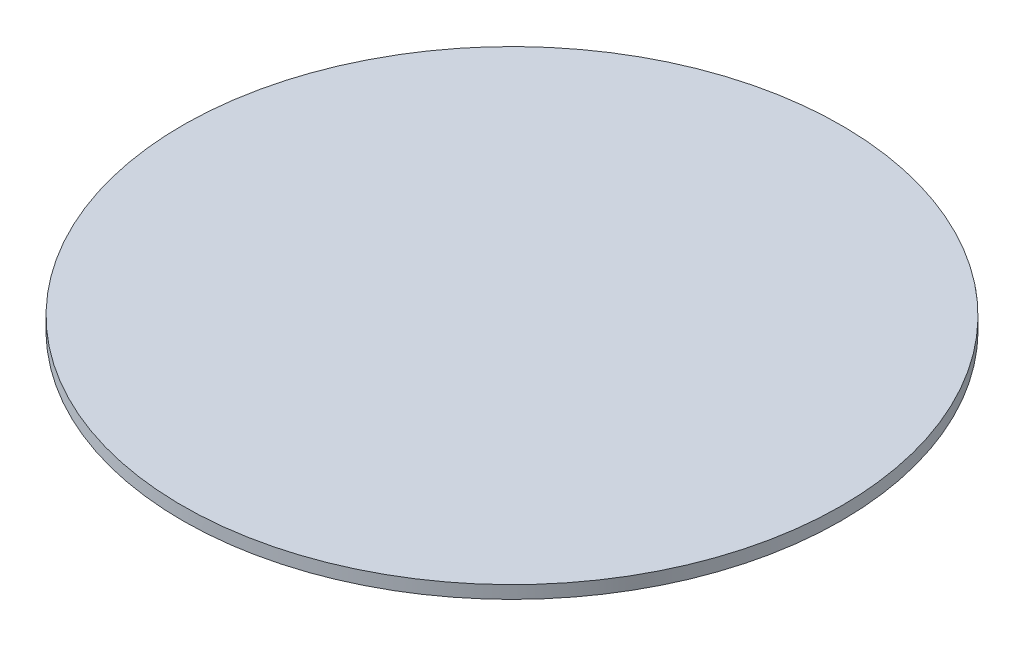
ISO-10303-21;
HEADER;
FILE_DESCRIPTION(('STEP AP214'),'2;1');
FILE_NAME('part.step','',(''),(''),'','','');
FILE_SCHEMA(('AUTOMOTIVE_DESIGN { 1 0 10303 214 1 1 1 1 }'));
ENDSEC;
DATA;
#1=APPLICATION_CONTEXT('core data for automotive mechanical design processes');
#2=APPLICATION_PROTOCOL_DEFINITION('international standard','automotive_design',2000,#1);
#3=PRODUCT_CONTEXT('',#1,'mechanical');
#4=PRODUCT('Part','Part','',(#3));
#5=PRODUCT_RELATED_PRODUCT_CATEGORY('part','',(#4));
#6=PRODUCT_DEFINITION_FORMATION('','',#4);
#7=PRODUCT_DEFINITION_CONTEXT('part definition',#1,'design');
#8=PRODUCT_DEFINITION('design','',#6,#7);
#9=PRODUCT_DEFINITION_SHAPE('','',#8);
#10=(LENGTH_UNIT() NAMED_UNIT(*) SI_UNIT(.MILLI.,.METRE.));
#11=(NAMED_UNIT(*) PLANE_ANGLE_UNIT() SI_UNIT($,.RADIAN.));
#12=(NAMED_UNIT(*) SI_UNIT($,.STERADIAN.) SOLID_ANGLE_UNIT());
#13=UNCERTAINTY_MEASURE_WITH_UNIT(LENGTH_MEASURE(1.E-05),#10,'distance_accuracy_value','');
#14=(GEOMETRIC_REPRESENTATION_CONTEXT(3) GLOBAL_UNCERTAINTY_ASSIGNED_CONTEXT((#13)) GLOBAL_UNIT_ASSIGNED_CONTEXT((#10,
#11,#12)) REPRESENTATION_CONTEXT('',''));
#15=CARTESIAN_POINT('',(0.,0.,0.));
#16=DIRECTION('',(0.,0.,1.));
#17=DIRECTION('',(1.,0.,0.));
#18=AXIS2_PLACEMENT_3D('',#15,#16,#17);
#19=CARTESIAN_POINT('',(109.960636938142,1.36028586489377,75.));
#20=CARTESIAN_POINT('',(109.960636938142,1.36028586489377,72.7118506445293));
#21=CARTESIAN_POINT('',(109.50991085592,1.36028586489377,68.135551933588));
#22=CARTESIAN_POINT('',(107.507625211775,1.36028586489377,61.5349007567413));
#23=CARTESIAN_POINT('',(104.256089761227,1.36028586489377,55.4517057924985));
#24=CARTESIAN_POINT('',(99.8802591881598,1.36028586489377,50.1197408118402));
#25=CARTESIAN_POINT('',(94.5482942075016,1.36028586489377,45.7439102387728));
#26=CARTESIAN_POINT('',(88.4650992432587,1.36028586489377,42.4923747882252));
#27=CARTESIAN_POINT('',(81.864448066412,1.36028586489377,40.4900891440799));
#28=CARTESIAN_POINT('',(75.,1.36028586489377,39.8140000207466));
#29=CARTESIAN_POINT('',(68.135551933588,1.36028586489377,40.4900891440799));
#30=CARTESIAN_POINT('',(61.5349007567413,1.36028586489377,42.4923747882252));
#31=CARTESIAN_POINT('',(55.4517057924985,1.36028586489377,45.7439102387728));
#32=CARTESIAN_POINT('',(50.1197408118402,1.36028586489377,50.1197408118402));
#33=CARTESIAN_POINT('',(45.7439102387728,1.36028586489377,55.4517057924985));
#34=CARTESIAN_POINT('',(42.4923747882252,1.36028586489377,61.5349007567413));
#35=CARTESIAN_POINT('',(40.4900891440799,1.36028586489377,68.135551933588));
#36=CARTESIAN_POINT('',(39.8140000207466,1.36028586489377,75.));
#37=CARTESIAN_POINT('',(40.4900891440799,1.36028586489377,81.864448066412));
#38=CARTESIAN_POINT('',(42.4923747882252,1.36028586489377,88.4650992432587));
#39=CARTESIAN_POINT('',(45.7439102387728,1.36028586489377,94.5482942075015));
#40=CARTESIAN_POINT('',(50.1197408118402,1.36028586489377,99.8802591881598));
#41=CARTESIAN_POINT('',(55.4517057924985,1.36028586489377,104.256089761227));
#42=CARTESIAN_POINT('',(61.5349007567413,1.36028586489377,107.507625211775));
#43=CARTESIAN_POINT('',(68.1355519335879,1.36028586489377,109.50991085592));
#44=CARTESIAN_POINT('',(75.,1.36028586489377,110.185999979253));
#45=CARTESIAN_POINT('',(81.864448066412,1.36028586489377,109.50991085592));
#46=CARTESIAN_POINT('',(88.4650992432587,1.36028586489377,107.507625211775));
#47=CARTESIAN_POINT('',(94.5482942075015,1.36028586489377,104.256089761227));
#48=CARTESIAN_POINT('',(99.8802591881598,1.36028586489377,99.8802591881598));
#49=CARTESIAN_POINT('',(104.256089761227,1.36028586489377,94.5482942075016));
#50=CARTESIAN_POINT('',(107.507625211775,1.36028586489377,88.4650992432587));
#51=CARTESIAN_POINT('',(109.50991085592,1.36028586489377,81.8644480664121));
#52=CARTESIAN_POINT('',(109.960636938142,1.36028586489377,77.2881493554707));
#53=CARTESIAN_POINT('',(109.960636938142,1.36028586489377,75.));
#54=B_SPLINE_CURVE_WITH_KNOTS('',3,(#19,#20,#21,#22,#23,#24,#25,#26,#27,#28,#29,#30,#31,#32,#33,
#34,#35,#36,#37,#38,#39,#40,#41,#42,#43,#44,#45,#46,#47,#48,#49,#50,#51,#52,#53),.UNSPECIFIED.,
.T.,.F.,(4,1,1,1,1,1,1,1,1,1,1,1,1,1,1,1,1,1,1,1,1,1,1,1,1,1,1,1,1,1,1,1,4),(0.,0.03125,0.0625,
0.09375,0.125,0.15625,0.1875,0.21875,0.25,0.28125,0.3125,0.34375,0.375,0.40625,0.4375,0.46875,
0.5,0.53125,0.5625,0.59375,0.625,0.65625,0.6875,0.71875,0.75,0.78125,0.8125,0.84375,0.875,
0.90625,0.9375,0.96875,1.),.UNSPECIFIED.);
#55=DIRECTION('',(0.,-1.,0.));
#56=VECTOR('',#55,1.);
#57=SURFACE_OF_LINEAR_EXTRUSION('',#54,#56);
#58=CARTESIAN_POINT('',(109.960636938142,1.36028586489377,75.));
#59=CARTESIAN_POINT('',(109.960636938142,1.36028586489377,77.2881493554707));
#60=CARTESIAN_POINT('',(109.50991085592,1.36028586489377,81.8644480664121));
#61=CARTESIAN_POINT('',(107.507625211775,1.36028586489377,88.4650992432587));
#62=CARTESIAN_POINT('',(104.256089761227,1.36028586489377,94.5482942075016));
#63=CARTESIAN_POINT('',(99.8802591881598,1.36028586489377,99.8802591881598));
#64=CARTESIAN_POINT('',(94.5482942075015,1.36028586489377,104.256089761227));
#65=CARTESIAN_POINT('',(88.4650992432587,1.36028586489377,107.507625211775));
#66=CARTESIAN_POINT('',(81.864448066412,1.36028586489377,109.50991085592));
#67=CARTESIAN_POINT('',(75.,1.36028586489377,110.185999979253));
#68=CARTESIAN_POINT('',(68.1355519335879,1.36028586489377,109.50991085592));
#69=CARTESIAN_POINT('',(61.5349007567413,1.36028586489377,107.507625211775));
#70=CARTESIAN_POINT('',(55.4517057924985,1.36028586489377,104.256089761227));
#71=CARTESIAN_POINT('',(50.1197408118402,1.36028586489377,99.8802591881598));
#72=CARTESIAN_POINT('',(45.7439102387728,1.36028586489377,94.5482942075015));
#73=CARTESIAN_POINT('',(42.4923747882252,1.36028586489377,88.4650992432587));
#74=CARTESIAN_POINT('',(40.4900891440799,1.36028586489377,81.864448066412));
#75=CARTESIAN_POINT('',(39.8140000207466,1.36028586489377,75.));
#76=CARTESIAN_POINT('',(40.4900891440799,1.36028586489377,68.135551933588));
#77=CARTESIAN_POINT('',(42.4923747882252,1.36028586489377,61.5349007567413));
#78=CARTESIAN_POINT('',(45.7439102387728,1.36028586489377,55.4517057924985));
#79=CARTESIAN_POINT('',(50.1197408118402,1.36028586489377,50.1197408118402));
#80=CARTESIAN_POINT('',(55.4517057924985,1.36028586489377,45.7439102387728));
#81=CARTESIAN_POINT('',(61.5349007567413,1.36028586489377,42.4923747882252));
#82=CARTESIAN_POINT('',(68.135551933588,1.36028586489377,40.4900891440799));
#83=CARTESIAN_POINT('',(75.,1.36028586489377,39.8140000207466));
#84=CARTESIAN_POINT('',(81.864448066412,1.36028586489377,40.4900891440799));
#85=CARTESIAN_POINT('',(88.4650992432587,1.36028586489377,42.4923747882252));
#86=CARTESIAN_POINT('',(94.5482942075016,1.36028586489377,45.7439102387728));
#87=CARTESIAN_POINT('',(99.8802591881598,1.36028586489377,50.1197408118402));
#88=CARTESIAN_POINT('',(104.256089761227,1.36028586489377,55.4517057924985));
#89=CARTESIAN_POINT('',(107.507625211775,1.36028586489377,61.5349007567413));
#90=CARTESIAN_POINT('',(109.50991085592,1.36028586489377,68.135551933588));
#91=CARTESIAN_POINT('',(109.960636938142,1.36028586489377,72.7118506445293));
#92=CARTESIAN_POINT('',(109.960636938142,1.36028586489377,75.));
#93=B_SPLINE_CURVE_WITH_KNOTS('',3,(#58,#59,#60,#61,#62,#63,#64,#65,#66,#67,#68,#69,#70,#71,#72,
#73,#74,#75,#76,#77,#78,#79,#80,#81,#82,#83,#84,#85,#86,#87,#88,#89,#90,#91,#92),.UNSPECIFIED.,
.T.,.F.,(4,1,1,1,1,1,1,1,1,1,1,1,1,1,1,1,1,1,1,1,1,1,1,1,1,1,1,1,1,1,1,1,4),(0.,0.03125,
0.0624999999999999,0.0937499999999999,0.125,0.15625,0.1875,0.21875,0.25,0.28125,0.3125,0.34375,
0.375,0.40625,0.4375,0.46875,0.5,0.53125,0.5625,0.59375,0.625,0.65625,0.6875,0.71875,0.75,
0.78125,0.8125,0.84375,0.875,0.90625,0.9375,0.96875,1.),.UNSPECIFIED.);
#94=CARTESIAN_POINT('',(109.960636938142,1.36028586489377,75.));
#95=VERTEX_POINT('',#94);
#96=EDGE_CURVE('E9',#95,#95,#93,.F.);
#97=ORIENTED_EDGE('',*,*,#96,.F.);
#98=EDGE_LOOP('',(#97));
#99=FACE_BOUND('',#98,.T.);
#100=CARTESIAN_POINT('',(109.960636938142,0.000999999999999916,75.));
#101=CARTESIAN_POINT('',(109.960636915795,0.000999999999999485,74.5423682963403));
#102=CARTESIAN_POINT('',(109.9516223464,0.000999999999999429,74.084738593119));
#103=CARTESIAN_POINT('',(109.915633566544,0.000999999999999535,73.1701826381083));
#104=CARTESIAN_POINT('',(109.888659238234,0.000999999999999696,72.7132563909545));
#105=CARTESIAN_POINT('',(109.816820273983,0.000999999999999702,71.800811280723));
#106=CARTESIAN_POINT('',(109.771955577568,0.000999999999999545,71.3452924224079));
#107=CARTESIAN_POINT('',(109.664404995955,0.000999999999999419,70.4363648101717));
#108=CARTESIAN_POINT('',(109.601719170999,0.00099999999999945,69.982956049123));
#109=CARTESIAN_POINT('',(109.458595311542,0.000999999999999515,69.0789513463994));
#110=CARTESIAN_POINT('',(109.378157393532,0.00099999999999955,68.6283553862869));
#111=CARTESIAN_POINT('',(109.199598811371,0.000999999999999415,67.7306807774109));
#112=CARTESIAN_POINT('',(109.10147814722,0.000999999999999245,67.2836021286476));
#113=CARTESIAN_POINT('',(108.887759733401,0.000999999999999286,66.3936395669513));
#114=CARTESIAN_POINT('',(108.772161869054,0.000999999999999498,65.9507556815629));
#115=CARTESIAN_POINT('',(108.523694095487,0.000999999999999467,65.0698581972033));
#116=CARTESIAN_POINT('',(108.390824127884,0.000999999999999224,64.6318446147003));
#117=CARTESIAN_POINT('',(108.108017110464,0.000999999999999307,63.7613638257889));
#118=CARTESIAN_POINT('',(107.958080118341,0.000999999999999632,63.328896600637));
#119=CARTESIAN_POINT('',(107.641343777703,0.000999999999999766,62.4701841862697));
#120=CARTESIAN_POINT('',(107.474544539842,0.000999999999999575,62.0439389562451));
#121=CARTESIAN_POINT('',(107.124289281574,0.00099999999999939,61.1983479614389));
#122=CARTESIAN_POINT('',(106.940833261168,0.000999999999999396,60.7790021966573));
#123=CARTESIAN_POINT('',(106.557598304182,0.000999999999999569,59.9478344110449));
#124=CARTESIAN_POINT('',(106.357819260501,0.000999999999999735,59.5360124396018));
#125=CARTESIAN_POINT('',(105.942271151596,0.000999999999999663,58.7205148111294));
#126=CARTESIAN_POINT('',(105.726502032323,0.000999999999999423,58.3168391816418));
#127=CARTESIAN_POINT('',(105.279306695039,0.000999999999999542,57.5182573491605));
#128=CARTESIAN_POINT('',(105.047880529956,0.000999999999999901,57.1233511165282));
#129=CARTESIAN_POINT('',(104.569703707848,0.000999999999999931,56.3429308150904));
#130=CARTESIAN_POINT('',(104.322953151388,0.000999999999999602,55.9574166846725));
#131=CARTESIAN_POINT('',(103.814461330226,0.000999999999999362,55.1964048948526));
#132=CARTESIAN_POINT('',(103.552720065523,0.000999999999999451,54.8209072354506));
#133=CARTESIAN_POINT('',(103.01469606983,0.000999999999999514,54.0804755369417));
#134=CARTESIAN_POINT('',(102.738413243433,0.000999999999999489,53.7155415671679));
#135=CARTESIAN_POINT('',(102.171754079978,0.000999999999999475,52.9967829113382));
#136=CARTESIAN_POINT('',(101.881377695282,0.000999999999999486,52.6429582628393));
#137=CARTESIAN_POINT('',(101.286979504154,0.000999999999999478,51.946964438699));
#138=CARTESIAN_POINT('',(100.98295774385,0.000999999999999459,51.6047952236627));
#139=CARTESIAN_POINT('',(100.361716507381,0.000999999999999505,50.9326581496905));
#140=CARTESIAN_POINT('',(100.044497117829,0.00099999999999957,50.6026902107065));
#141=CARTESIAN_POINT('',(99.3973097892936,0.000999999999999395,49.9555028821709));
#142=CARTESIAN_POINT('',(99.0673418503095,0.000999999999999154,49.6382834926194));
#143=CARTESIAN_POINT('',(98.3952047763373,0.000999999999999376,49.0170422561501));
#144=CARTESIAN_POINT('',(98.053035561301,0.000999999999999838,48.7130204958461));
#145=CARTESIAN_POINT('',(97.3570417371607,0.000999999999999994,48.1186223047178));
#146=CARTESIAN_POINT('',(97.0032170886618,0.000999999999999687,47.8282459200224));
#147=CARTESIAN_POINT('',(96.2844584328321,0.000999999999999711,47.261586756567));
#148=CARTESIAN_POINT('',(95.9195244630583,0.00100000000000004,46.9853039301699));
#149=CARTESIAN_POINT('',(95.1790927645494,0.00100000000000022,46.4472799344772));
#150=CARTESIAN_POINT('',(94.8035951051474,0.00100000000000007,46.185538669774));
#151=CARTESIAN_POINT('',(94.0425833153275,0.00099999999999976,45.6770468486116));
#152=CARTESIAN_POINT('',(93.6570691849096,0.000999999999999601,45.4302962921524));
#153=CARTESIAN_POINT('',(92.8766488834719,0.000999999999999797,44.9521194700439));
#154=CARTESIAN_POINT('',(92.4817426508395,0.00100000000000015,44.720693304961));
#155=CARTESIAN_POINT('',(91.6831608183582,0.00100000000000011,44.2734979676768));
#156=CARTESIAN_POINT('',(91.2794851888705,0.000999999999999715,44.0577288484037));
#157=CARTESIAN_POINT('',(90.4639875603984,0.000999999999999683,43.6421807394988));
#158=CARTESIAN_POINT('',(90.0521655889557,0.00100000000000005,43.4424016958181));
#159=CARTESIAN_POINT('',(89.2209978033422,0.00100000000000022,43.059166738832));
#160=CARTESIAN_POINT('',(88.801652038559,0.00100000000000002,42.875710718426));
#161=CARTESIAN_POINT('',(87.9560610437572,0.000999999999999813,42.5254554601586));
#162=CARTESIAN_POINT('',(87.5298158137385,0.000999999999999805,42.3586562222971));
#163=CARTESIAN_POINT('',(86.6711033993548,0.00100000000000003,42.0419198816585));
#164=CARTESIAN_POINT('',(86.2386361741805,0.00100000000000026,41.8919828895354));
#165=CARTESIAN_POINT('',(85.3681553853304,0.00100000000000001,41.6091758721171));
#166=CARTESIAN_POINT('',(84.9301418029113,0.000999999999999528,41.4763059045153));
#167=CARTESIAN_POINT('',(84.0492443183226,0.000999999999999436,41.227838130944));
#168=CARTESIAN_POINT('',(83.6063604326213,0.000999999999999825,41.112240266591));
#169=CARTESIAN_POINT('',(82.7163978717799,0.00100000000000001,40.8985218527879));
#170=CARTESIAN_POINT('',(82.2693192241843,0.000999999999999799,40.8004011886599));
#171=CARTESIAN_POINT('',(81.371644612118,0.000999999999999599,40.6218426064372));
#172=CARTESIAN_POINT('',(80.9210486476472,0.000999999999999608,40.5414046883424));
#173=CARTESIAN_POINT('',(80.0170439568307,0.00099999999999979,40.3982808291166));
#174=CARTESIAN_POINT('',(79.5636352120475,0.000999999999999964,40.335595004475));
#175=CARTESIAN_POINT('',(78.654707555373,0.000999999999999868,40.2280444220021));
#176=CARTESIAN_POINT('',(78.1991886363539,0.000999999999999597,40.1831797244121));
#177=CARTESIAN_POINT('',(77.2867436919685,0.000999999999999367,40.1113407633704));
#178=CARTESIAN_POINT('',(76.8298176713638,0.000999999999999408,40.0843664394442));
#179=CARTESIAN_POINT('',(75.915261097411,0.000999999999999556,40.0483776476118));
#180=CARTESIAN_POINT('',(75.4576305487055,0.000999999999999663,40.0393630618577));
#181=CARTESIAN_POINT('',(74.5423694512945,0.000999999999999735,40.0393630618577));
#182=CARTESIAN_POINT('',(74.0847389025891,0.000999999999999702,40.0483776476118));
#183=CARTESIAN_POINT('',(73.1701823286362,0.000999999999999696,40.0843664394442));
#184=CARTESIAN_POINT('',(72.7132563080316,0.000999999999999723,40.1113407633704));
#185=CARTESIAN_POINT('',(71.8008113636462,0.000999999999999675,40.1831797244121));
#186=CARTESIAN_POINT('',(71.3452924446271,0.000999999999999598,40.2280444220021));
#187=CARTESIAN_POINT('',(70.4363647879526,0.0009999999999998,40.335595004475));
#188=CARTESIAN_POINT('',(69.9829560431694,0.00100000000000008,40.3982808291166));
#189=CARTESIAN_POINT('',(69.0789513523529,0.00100000000000019,40.5414046883424));
#190=CARTESIAN_POINT('',(68.6283553878821,0.00100000000000002,40.6218426064372));
#191=CARTESIAN_POINT('',(67.7306807758157,0.000999999999999809,40.8004011886599));
#192=CARTESIAN_POINT('',(67.2836021282201,0.00099999999999976,40.8985218527879));
#193=CARTESIAN_POINT('',(66.3936395673787,0.000999999999999638,41.112240266591));
#194=CARTESIAN_POINT('',(65.9507556816774,0.000999999999999565,41.227838130944));
#195=CARTESIAN_POINT('',(65.0698581970888,0.0009999999999994,41.4763059045153));
#196=CARTESIAN_POINT('',(64.6318446146696,0.000999999999999308,41.6091758721171));
#197=CARTESIAN_POINT('',(63.7613638258196,0.000999999999999656,41.8919828895354));
#198=CARTESIAN_POINT('',(63.3288966006453,0.00100000000000009,42.0419198816585));
#199=CARTESIAN_POINT('',(62.4701841862615,0.00100000000000017,42.3586562222971));
#200=CARTESIAN_POINT('',(62.0439389562429,0.000999999999999807,42.5254554601585));
#201=CARTESIAN_POINT('',(61.1983479614411,0.000999999999999591,42.875710718426));
#202=CARTESIAN_POINT('',(60.7790021966579,0.000999999999999738,43.059166738832));
#203=CARTESIAN_POINT('',(59.9478344110443,0.00099999999999966,43.4424016958181));
#204=CARTESIAN_POINT('',(59.5360124396017,0.000999999999999436,43.6421807394988));
#205=CARTESIAN_POINT('',(58.7205148111296,0.000999999999999528,44.0577288484036));
#206=CARTESIAN_POINT('',(58.3168391816419,0.000999999999999843,44.2734979676768));
#207=CARTESIAN_POINT('',(57.5182573491606,0.000999999999999988,44.7206933049609));
#208=CARTESIAN_POINT('',(57.1233511165282,0.000999999999999818,44.9521194700439));
#209=CARTESIAN_POINT('',(56.3429308150905,0.00099999999999958,45.4302962921524));
#210=CARTESIAN_POINT('',(55.9574166846725,0.000999999999999513,45.6770468486116));
#211=CARTESIAN_POINT('',(55.1964048948526,0.000999999999999452,46.1855386697739));
#212=CARTESIAN_POINT('',(54.8209072354507,0.000999999999999459,46.4472799344772));
#213=CARTESIAN_POINT('',(54.0804755369418,0.000999999999999505,46.9853039301699));
#214=CARTESIAN_POINT('',(53.7155415671679,0.000999999999999545,47.261586756567));
#215=CARTESIAN_POINT('',(52.9967829113382,0.00099999999999942,47.8282459200223));
#216=CARTESIAN_POINT('',(52.6429582628393,0.000999999999999255,48.1186223047178));
#217=CARTESIAN_POINT('',(51.946964438699,0.000999999999999276,48.7130204958461));
#218=CARTESIAN_POINT('',(51.6047952236627,0.000999999999999461,49.01704225615));
#219=CARTESIAN_POINT('',(50.9326581496905,0.000999999999999504,49.6382834926194));
#220=CARTESIAN_POINT('',(50.6026902107065,0.000999999999999361,49.9555028821709));
#221=CARTESIAN_POINT('',(49.9555028821709,0.00099999999999917,50.6026902107064));
#222=CARTESIAN_POINT('',(49.6382834926195,0.00099999999999912,50.9326581496905));
#223=CARTESIAN_POINT('',(49.0170422561501,0.000999999999999411,51.6047952236627));
#224=CARTESIAN_POINT('',(48.7130204958461,0.000999999999999752,51.946964438699));
#225=CARTESIAN_POINT('',(48.1186223047178,0.000999999999999646,52.6429582628393));
#226=CARTESIAN_POINT('',(47.8282459200223,0.000999999999999199,52.9967829113382));
#227=CARTESIAN_POINT('',(47.261586756567,0.000999999999999332,53.7155415671679));
#228=CARTESIAN_POINT('',(46.9853039301699,0.00099999999999991,54.0804755369417));
#229=CARTESIAN_POINT('',(46.4472799344772,0.00100000000000035,54.8209072354506));
#230=CARTESIAN_POINT('',(46.185538669774,0.00100000000000022,55.1964048948526));
#231=CARTESIAN_POINT('',(45.6770468486116,0.00100000000000004,55.9574166846725));
#232=CARTESIAN_POINT('',(45.4302962921524,0.001,56.3429308150904));
#233=CARTESIAN_POINT('',(44.9521194700439,0.00099999999999983,57.1233511165282));
#234=CARTESIAN_POINT('',(44.720693304961,0.0009999999999997,57.5182573491605));
#235=CARTESIAN_POINT('',(44.2734979676768,0.000999999999999698,58.3168391816419));
#236=CARTESIAN_POINT('',(44.0577288484037,0.000999999999999825,58.7205148111296));
#237=CARTESIAN_POINT('',(43.6421807394988,0.00100000000000001,59.5360124396016));
#238=CARTESIAN_POINT('',(43.4424016958181,0.00100000000000006,59.9478344110443));
#239=CARTESIAN_POINT('',(43.059166738832,0.000999999999999771,60.7790021966579));
#240=CARTESIAN_POINT('',(42.875710718426,0.000999999999999427,61.198347961441));
#241=CARTESIAN_POINT('',(42.5254554601585,0.000999999999999104,62.0439389562428));
#242=CARTESIAN_POINT('',(42.3586562222971,0.000999999999999124,62.4701841862615));
#243=CARTESIAN_POINT('',(42.0419198816585,0.000999999999999407,63.3288966006452));
#244=CARTESIAN_POINT('',(41.8919828895354,0.000999999999999671,63.7613638258195));
#245=CARTESIAN_POINT('',(41.6091758721171,0.000999999999999727,64.6318446146696));
#246=CARTESIAN_POINT('',(41.4763059045153,0.00099999999999952,65.0698581970887));
#247=CARTESIAN_POINT('',(41.227838130944,0.000999999999999444,65.9507556816774));
#248=CARTESIAN_POINT('',(41.112240266591,0.000999999999999577,66.3936395673787));
#249=CARTESIAN_POINT('',(40.8985218527879,0.000999999999999822,67.2836021282201));
#250=CARTESIAN_POINT('',(40.8004011886599,0.000999999999999935,67.7306807758157));
#251=CARTESIAN_POINT('',(40.6218426064372,0.000999999999999897,68.6283553878821));
#252=CARTESIAN_POINT('',(40.5414046883424,0.000999999999999746,69.0789513523529));
#253=CARTESIAN_POINT('',(40.3982808291166,0.000999999999999652,69.9829560431693));
#254=CARTESIAN_POINT('',(40.335595004475,0.000999999999999709,70.4363647879526));
#255=CARTESIAN_POINT('',(40.2280444220021,0.00099999999999969,71.345292444627));
#256=CARTESIAN_POINT('',(40.1831797244121,0.000999999999999614,71.8008113636461));
#257=CARTESIAN_POINT('',(40.1113407633704,0.000999999999999784,72.7132563080315));
#258=CARTESIAN_POINT('',(40.0843664394442,0.00100000000000003,73.1701823286362));
#259=CARTESIAN_POINT('',(40.0483776476118,0.00100000000000023,74.084738902589));
#260=CARTESIAN_POINT('',(40.0393630618577,0.00100000000000019,74.5423694512945));
#261=CARTESIAN_POINT('',(40.0393630618577,0.00100000000000007,75.4576305487055));
#262=CARTESIAN_POINT('',(40.0483776476118,0.001,75.9152610974109));
#263=CARTESIAN_POINT('',(40.0843664394442,0.000999999999999832,76.8298176713637));
#264=CARTESIAN_POINT('',(40.1113407633704,0.000999999999999739,77.2867436919684));
#265=CARTESIAN_POINT('',(40.1831797244121,0.000999999999999659,78.1991886363538));
#266=CARTESIAN_POINT('',(40.2280444220021,0.000999999999999672,78.6547075553729));
#267=CARTESIAN_POINT('',(40.335595004475,0.000999999999999726,79.5636352120474));
#268=CARTESIAN_POINT('',(40.3982808291166,0.000999999999999766,80.0170439568306));
#269=CARTESIAN_POINT('',(40.5414046883424,0.000999999999999632,80.9210486476471));
#270=CARTESIAN_POINT('',(40.6218426064372,0.000999999999999459,81.3716446121179));
#271=CARTESIAN_POINT('',(40.8004011886599,0.000999999999999505,82.2693192241842));
#272=CARTESIAN_POINT('',(40.8985218527878,0.000999999999999724,82.7163978717798));
#273=CARTESIAN_POINT('',(41.112240266591,0.000999999999999674,83.6063604326212));
#274=CARTESIAN_POINT('',(41.227838130944,0.000999999999999406,84.0492443183226));
#275=CARTESIAN_POINT('',(41.4763059045153,0.000999999999999125,84.9301418029112));
#276=CARTESIAN_POINT('',(41.6091758721171,0.000999999999999113,85.3681553853304));
#277=CARTESIAN_POINT('',(41.8919828895353,0.000999999999999418,86.2386361741804));
#278=CARTESIAN_POINT('',(42.0419198816585,0.000999999999999735,86.6711033993547));
#279=CARTESIAN_POINT('',(42.358656222297,0.0010000000000001,87.5298158137384));
#280=CARTESIAN_POINT('',(42.5254554601585,0.00100000000000014,87.9560610437571));
#281=CARTESIAN_POINT('',(42.875710718426,0.000999999999999692,88.8016520385589));
#282=CARTESIAN_POINT('',(43.059166738832,0.000999999999999201,89.2209978033421));
#283=CARTESIAN_POINT('',(43.442401695818,0.00099999999999933,90.0521655889556));
#284=CARTESIAN_POINT('',(43.6421807394987,0.000999999999999949,90.4639875603983));
#285=CARTESIAN_POINT('',(44.0577288484036,0.00100000000000032,91.2794851888704));
#286=CARTESIAN_POINT('',(44.2734979676767,0.00100000000000007,91.683160818358));
#287=CARTESIAN_POINT('',(44.7206933049609,0.000999999999999766,92.4817426508394));
#288=CARTESIAN_POINT('',(44.9521194700439,0.000999999999999719,92.8766488834718));
#289=CARTESIAN_POINT('',(45.4302962921524,0.000999999999999679,93.6570691849095));
#290=CARTESIAN_POINT('',(45.6770468486115,0.000999999999999687,94.0425833153274));
#291=CARTESIAN_POINT('',(46.1855386697739,0.000999999999999711,94.8035951051473));
#292=CARTESIAN_POINT('',(46.4472799344772,0.000999999999999728,95.1790927645493));
#293=CARTESIAN_POINT('',(46.9853039301698,0.00099999999999967,95.9195244630582));
#294=CARTESIAN_POINT('',(47.261586756567,0.000999999999999597,96.2844584328321));
#295=CARTESIAN_POINT('',(47.8282459200223,0.000999999999999801,97.0032170886618));
#296=CARTESIAN_POINT('',(48.1186223047177,0.00100000000000008,97.3570417371607));
#297=CARTESIAN_POINT('',(48.713020495846,0.00100000000000019,98.053035561301));
#298=CARTESIAN_POINT('',(49.01704225615,0.00100000000000001,98.3952047763373));
#299=CARTESIAN_POINT('',(49.6382834926194,0.000999999999999818,99.0673418503094));
#300=CARTESIAN_POINT('',(49.9555028821709,0.000999999999999794,99.3973097892935));
#301=CARTESIAN_POINT('',(50.6026902107064,0.000999999999999604,100.044497117829));
#302=CARTESIAN_POINT('',(50.9326581496905,0.000999999999999439,100.361716507381));
#303=CARTESIAN_POINT('',(51.6047952236626,0.000999999999999525,100.98295774385));
#304=CARTESIAN_POINT('',(51.9469644386989,0.000999999999999776,101.286979504154));
#305=CARTESIAN_POINT('',(52.6429582628392,0.00100000000000006,101.881377695282));
#306=CARTESIAN_POINT('',(52.9967829113381,0.00100000000000009,102.171754079978));
#307=CARTESIAN_POINT('',(53.7155415671678,0.00100000000000018,102.738413243433));
#308=CARTESIAN_POINT('',(54.0804755369417,0.00100000000000025,103.01469606983));
#309=CARTESIAN_POINT('',(54.8209072354506,0.00100000000000002,103.552720065523));
#310=CARTESIAN_POINT('',(55.1964048948525,0.000999999999999727,103.814461330226));
#311=CARTESIAN_POINT('',(55.9574166846724,0.000999999999999671,104.322953151388));
#312=CARTESIAN_POINT('',(56.3429308150903,0.000999999999999907,104.569703707848));
#313=CARTESIAN_POINT('',(57.123351116528,0.000999999999999924,105.047880529956));
#314=CARTESIAN_POINT('',(57.5182573491604,0.000999999999999705,105.279306695039));
#315=CARTESIAN_POINT('',(58.3168391816418,0.000999999999999693,105.726502032323));
#316=CARTESIAN_POINT('',(58.7205148111295,0.0009999999999999,105.942271151596));
#317=CARTESIAN_POINT('',(59.5360124396016,0.000999999999999931,106.357819260501));
#318=CARTESIAN_POINT('',(59.9478344110442,0.000999999999999756,106.557598304182));
#319=CARTESIAN_POINT('',(60.7790021966578,0.000999999999999642,106.940833261168));
#320=CARTESIAN_POINT('',(61.198347961441,0.000999999999999704,107.124289281574));
#321=CARTESIAN_POINT('',(62.0439389562428,0.000999999999999694,107.474544539841));
#322=CARTESIAN_POINT('',(62.4701841862614,0.000999999999999621,107.641343777703));
#323=CARTESIAN_POINT('',(63.3288966006452,0.000999999999999344,107.958080118342));
#324=CARTESIAN_POINT('',(63.7613638258195,0.000999999999999141,108.108017110465));
#325=CARTESIAN_POINT('',(64.6318446146695,0.00099999999999939,108.390824127883));
#326=CARTESIAN_POINT('',(65.0698581970886,0.000999999999999843,108.523694095485));
#327=CARTESIAN_POINT('',(65.9507556816773,0.000999999999999989,108.772161869056));
#328=CARTESIAN_POINT('',(66.3936395673786,0.000999999999999683,108.887759733409));
#329=CARTESIAN_POINT('',(67.28360212822,0.000999999999999715,109.101478147212));
#330=CARTESIAN_POINT('',(67.7306807758156,0.00100000000000005,109.19959881134));
#331=CARTESIAN_POINT('',(68.628355387882,0.00100000000000021,109.378157393563));
#332=CARTESIAN_POINT('',(69.0789513523528,0.00100000000000003,109.458595311658));
#333=CARTESIAN_POINT('',(69.9829560431693,0.000999999999999801,109.601719170883));
#334=CARTESIAN_POINT('',(70.4363647879525,0.000999999999999753,109.664404995525));
#335=CARTESIAN_POINT('',(71.345292444627,0.000999999999999645,109.771955577998));
#336=CARTESIAN_POINT('',(71.8008113636461,0.000999999999999587,109.816820275588));
#337=CARTESIAN_POINT('',(72.7132563080315,0.000999999999999812,109.88865923663));
#338=CARTESIAN_POINT('',(73.1701823286361,0.00100000000000009,109.915633560556));
#339=CARTESIAN_POINT('',(74.084738902589,0.00100000000000017,109.951622352388));
#340=CARTESIAN_POINT('',(74.5423694512944,0.000999999999999963,109.960636938142));
#341=CARTESIAN_POINT('',(75.4576305487054,0.000999999999999869,109.960636938142));
#342=CARTESIAN_POINT('',(75.9152610974109,0.000999999999999983,109.951622352388));
#343=CARTESIAN_POINT('',(76.8298176713637,0.000999999999999849,109.915633560556));
#344=CARTESIAN_POINT('',(77.2867436919684,0.000999999999999601,109.88865923663));
#345=CARTESIAN_POINT('',(78.1991886363538,0.000999999999999363,109.816820275588));
#346=CARTESIAN_POINT('',(78.6547075553729,0.000999999999999372,109.771955577998));
#347=CARTESIAN_POINT('',(79.5636352120474,0.000999999999999593,109.664404995525));
#348=CARTESIAN_POINT('',(80.0170439568306,0.000999999999999804,109.601719170883));
#349=CARTESIAN_POINT('',(80.9210486476471,0.00100000000000003,109.458595311658));
#350=CARTESIAN_POINT('',(81.3716446121179,0.00100000000000004,109.378157393563));
#351=CARTESIAN_POINT('',(82.2693192241842,0.000999999999999793,109.19959881134));
#352=CARTESIAN_POINT('',(82.7163978717798,0.000999999999999533,109.101478147212));
#353=CARTESIAN_POINT('',(83.6063604326212,0.000999999999999431,108.887759733409));
#354=CARTESIAN_POINT('',(84.0492443183226,0.000999999999999587,108.772161869056));
#355=CARTESIAN_POINT('',(84.9301418029112,0.000999999999999811,108.523694095485));
#356=CARTESIAN_POINT('',(85.3681553853304,0.000999999999999878,108.390824127883));
#357=CARTESIAN_POINT('',(86.2386361741804,0.000999999999999954,108.108017110465));
#358=CARTESIAN_POINT('',(86.6711033993547,0.000999999999999962,107.958080118342));
#359=CARTESIAN_POINT('',(87.5298158137384,0.00099999999999987,107.641343777703));
#360=CARTESIAN_POINT('',(87.9560610437571,0.00099999999999977,107.474544539842));
#361=CARTESIAN_POINT('',(88.8016520385589,0.000999999999999628,107.124289281574));
#362=CARTESIAN_POINT('',(89.2209978033421,0.000999999999999586,106.940833261168));
#363=CARTESIAN_POINT('',(90.0521655889556,0.000999999999999378,106.557598304182));
#364=CARTESIAN_POINT('',(90.4639875603983,0.000999999999999213,106.357819260501));
#365=CARTESIAN_POINT('',(91.2794851888704,0.000999999999999317,105.942271151596));
#366=CARTESIAN_POINT('',(91.6831608183581,0.000999999999999587,105.726502032323));
#367=CARTESIAN_POINT('',(92.4817426508395,0.000999999999999812,105.279306695039));
#368=CARTESIAN_POINT('',(92.8766488834718,0.000999999999999767,105.047880529956));
#369=CARTESIAN_POINT('',(93.6570691849095,0.000999999999999631,104.569703707848));
#370=CARTESIAN_POINT('',(94.0425833153274,0.000999999999999538,104.322953151388));
#371=CARTESIAN_POINT('',(94.8035951051473,0.000999999999999426,103.814461330226));
#372=CARTESIAN_POINT('',(95.1790927645493,0.000999999999999406,103.552720065523));
#373=CARTESIAN_POINT('',(95.9195244630582,0.000999999999999558,103.01469606983));
#374=CARTESIAN_POINT('',(96.2844584328321,0.000999999999999729,102.738413243433));
#375=CARTESIAN_POINT('',(97.0032170886618,0.000999999999999669,102.171754079978));
#376=CARTESIAN_POINT('',(97.3570417371607,0.000999999999999437,101.881377695282));
#377=CARTESIAN_POINT('',(98.053035561301,0.000999999999999528,101.286979504154));
#378=CARTESIAN_POINT('',(98.3952047763373,0.000999999999999851,100.98295774385));
#379=CARTESIAN_POINT('',(99.0673418503094,0.000999999999999981,100.361716507381));
#380=CARTESIAN_POINT('',(99.3973097892935,0.000999999999999787,100.044497117829));
#381=CARTESIAN_POINT('',(100.044497117829,0.000999999999999611,99.3973097892936));
#382=CARTESIAN_POINT('',(100.361716507381,0.00099999999999963,99.0673418503095));
#383=CARTESIAN_POINT('',(100.98295774385,0.000999999999999768,98.3952047763374));
#384=CARTESIAN_POINT('',(101.286979504154,0.000999999999999888,98.0530355613011));
#385=CARTESIAN_POINT('',(101.881377695282,0.000999999999999943,97.3570417371608));
#386=CARTESIAN_POINT('',(102.171754079978,0.000999999999999878,97.0032170886619));
#387=CARTESIAN_POINT('',(102.738413243433,0.000999999999999953,96.2844584328322));
#388=CARTESIAN_POINT('',(103.01469606983,0.00100000000000009,95.9195244630584));
#389=CARTESIAN_POINT('',(103.552720065523,0.00100000000000017,95.1790927645495));
#390=CARTESIAN_POINT('',(103.814461330226,0.00100000000000011,94.8035951051475));
#391=CARTESIAN_POINT('',(104.322953151388,0.00100000000000015,94.0425833153276));
#392=CARTESIAN_POINT('',(104.569703707848,0.00100000000000026,93.6570691849097));
#393=CARTESIAN_POINT('',(105.047880529956,0.00100000000000001,92.8766488834719));
#394=CARTESIAN_POINT('',(105.279306695039,0.000999999999999648,92.4817426508395));
#395=CARTESIAN_POINT('',(105.726502032323,0.000999999999999316,91.6831608183582));
#396=CARTESIAN_POINT('',(105.942271151596,0.000999999999999343,91.2794851888707));
#397=CARTESIAN_POINT('',(106.357819260501,0.000999999999999622,90.4639875603983));
#398=CARTESIAN_POINT('',(106.557598304182,0.000999999999999874,90.0521655889552));
#399=CARTESIAN_POINT('',(106.940833261168,0.000999999999999958,89.2209978033428));
#400=CARTESIAN_POINT('',(107.124289281574,0.000999999999999791,88.8016520385613));
#401=CARTESIAN_POINT('',(107.474544539842,0.000999999999999608,87.956061043755));
#402=CARTESIAN_POINT('',(107.641343777703,0.000999999999999593,87.5298158137304));
#403=CARTESIAN_POINT('',(107.958080118341,0.000999999999999372,86.6711033993631));
#404=CARTESIAN_POINT('',(108.108017110464,0.000999999999999166,86.2386361742112));
#405=CARTESIAN_POINT('',(108.390824127883,0.000999999999999364,85.3681553852998));
#406=CARTESIAN_POINT('',(108.523694095487,0.000999999999999768,84.9301418027968));
#407=CARTESIAN_POINT('',(108.772161869054,0.00100000000000006,84.0492443184373));
#408=CARTESIAN_POINT('',(108.887759733401,0.000999999999999954,83.6063604330488));
#409=CARTESIAN_POINT('',(109.10147814722,0.000999999999999878,82.7163978713525));
#410=CARTESIAN_POINT('',(109.199598811371,0.00099999999999991,82.2693192225892));
#411=CARTESIAN_POINT('',(109.378157393532,0.000999999999999922,81.3716446137133));
#412=CARTESIAN_POINT('',(109.458595311542,0.000999999999999901,80.9210486536007));
#413=CARTESIAN_POINT('',(109.601719170999,0.000999999999999931,80.0170439508772));
#414=CARTESIAN_POINT('',(109.664404995955,0.000999999999999983,79.5636351898284));
#415=CARTESIAN_POINT('',(109.771955577568,0.000999999999999849,78.6547075775922));
#416=CARTESIAN_POINT('',(109.816820273983,0.000999999999999665,78.1991887192771));
#417=CARTESIAN_POINT('',(109.888659238234,0.000999999999999734,77.2867436090456));
#418=CARTESIAN_POINT('',(109.915633566544,0.000999999999999987,76.8298173618918));
#419=CARTESIAN_POINT('',(109.9516223464,0.00100000000000028,75.9152614068811));
#420=CARTESIAN_POINT('',(109.960636915795,0.00100000000000032,75.4576317036598));
#421=CARTESIAN_POINT('',(109.960636938142,0.000999999999999916,75.0000000000001));
#422=B_SPLINE_CURVE_WITH_KNOTS('',3,(#100,#101,#102,#103,#104,#105,#106,#107,#108,#109,#110,
#111,#112,#113,#114,#115,#116,#117,#118,#119,#120,#121,#122,#123,#124,#125,#126,#127,#128,#129,
#130,#131,#132,#133,#134,#135,#136,#137,#138,#139,#140,#141,#142,#143,#144,#145,#146,#147,#148,
#149,#150,#151,#152,#153,#154,#155,#156,#157,#158,#159,#160,#161,#162,#163,#164,#165,#166,#167,
#168,#169,#170,#171,#172,#173,#174,#175,#176,#177,#178,#179,#180,#181,#182,#183,#184,#185,#186,
#187,#188,#189,#190,#191,#192,#193,#194,#195,#196,#197,#198,#199,#200,#201,#202,#203,#204,#205,
#206,#207,#208,#209,#210,#211,#212,#213,#214,#215,#216,#217,#218,#219,#220,#221,#222,#223,#224,
#225,#226,#227,#228,#229,#230,#231,#232,#233,#234,#235,#236,#237,#238,#239,#240,#241,#242,#243,
#244,#245,#246,#247,#248,#249,#250,#251,#252,#253,#254,#255,#256,#257,#258,#259,#260,#261,#262,
#263,#264,#265,#266,#267,#268,#269,#270,#271,#272,#273,#274,#275,#276,#277,#278,#279,#280,#281,
#282,#283,#284,#285,#286,#287,#288,#289,#290,#291,#292,#293,#294,#295,#296,#297,#298,#299,#300,
#301,#302,#303,#304,#305,#306,#307,#308,#309,#310,#311,#312,#313,#314,#315,#316,#317,#318,#319,
#320,#321,#322,#323,#324,#325,#326,#327,#328,#329,#330,#331,#332,#333,#334,#335,#336,#337,#338,
#339,#340,#341,#342,#343,#344,#345,#346,#347,#348,#349,#350,#351,#352,#353,#354,#355,#356,#357,
#358,#359,#360,#361,#362,#363,#364,#365,#366,#367,#368,#369,#370,#371,#372,#373,#374,#375,#376,
#377,#378,#379,#380,#381,#382,#383,#384,#385,#386,#387,#388,#389,#390,#391,#392,#393,#394,#395,
#396,#397,#398,#399,#400,#401,#402,#403,#404,#405,#406,#407,#408,#409,#410,#411,#412,#413,#414,
#415,#416,#417,#418,#419,#420,#421),.UNSPECIFIED.,.F.,.F.,(4,2,2,2,2,2,2,2,2,2,2,2,2,2,2,2,2,2,
2,2,2,2,2,2,2,2,2,2,2,2,2,2,2,2,2,2,2,2,2,2,2,2,2,2,2,2,2,2,2,2,2,2,2,2,2,2,2,2,2,2,2,2,2,2,2,2,
2,2,2,2,2,2,2,2,2,2,2,2,2,2,2,2,2,2,2,2,2,2,2,2,2,2,2,2,2,2,2,2,2,2,2,2,2,2,2,2,2,2,2,2,2,2,2,2,
2,2,2,2,2,2,2,2,2,2,2,2,2,2,2,2,2,2,2,2,2,2,2,2,2,2,2,2,2,2,2,2,2,2,2,2,2,2,2,2,2,2,2,2,2,2,4),
(0.,1.3728036003673,2.74561620886711,4.1184334578971,5.49124606639693,6.86404966676423,
8.23685326713152,9.60966587563135,10.9824831246613,12.3552957331612,13.7280993335285,
15.1009029338958,16.4737155423956,17.8465327914256,19.2193453999254,20.5921490002927,
21.96495260066,23.3377652091598,24.7105824581898,26.0833950666896,27.4561986670569,
28.8290022674242,30.2018148759241,31.574632124954,32.9474447334538,34.3202483338211,
35.6930519341884,37.0658645426883,38.4386817917183,39.8114944002181,41.1842980005854,
42.5571016009527,43.9299142094525,45.3027314584825,46.6755440669823,48.0483476673496,
49.4211512677169,50.7939638762168,52.1667811252467,53.5395937337466,54.9123973341139,
56.2852009344811,57.658013542981,59.030830792011,60.4036434005108,61.7764470008781,
63.1492506012454,64.5220632097452,65.8948804587752,67.267693067275,68.6404966676423,
70.0133002680096,71.3861128765095,72.7589301255394,74.1317427340393,75.5045463344066,
76.8773499347738,78.2501625432737,79.6229797923037,80.9957924008035,82.3685960011708,
83.7413996015381,85.1142122100379,86.4870294590679,87.8598420675677,89.232645667935,
90.6054492683023,91.9782618768022,93.3510791258321,94.7238917343319,96.0966953346992,
97.4694989350665,98.8423115435664,100.215128792596,101.587941401096,102.960745001463,
104.333548601831,105.706361210331,107.079178459361,108.45199106786,109.824794668228,
111.197598268595,112.570410877095,113.943228126125,115.316040734625,116.688844334992,
118.061647935359,119.434460543859,120.807277792889,122.180090401389,123.552894001756,
124.925697602123,126.298510210623,127.671327459653,129.044140068153,130.41694366852,
131.789747268888,133.162559877387,134.535377126417,135.908189734917,137.280993335285,
138.653796935652,140.026609544152,141.399426793182,142.772239401682,144.145043002049,
145.517846602416,146.890659210916,148.263476459946,149.636289068446,151.009092668813,
152.38189626918,153.75470887768,155.12752612671,156.50033873521,157.873142335577,
159.245945935945,160.618758544444,161.991575793474,163.364388401974,164.737192002341,
166.109995602709,167.482808211209,168.855625460239,170.228438068738,171.601241669106,
172.974045269473,174.346857877973,175.719675127003,177.092487735503,178.46529133587,
179.838094936237,181.210907544737,182.583724793767,183.956537402267,185.329341002634,
186.702144603001,188.074957211501,189.447774460531,190.820587069031,192.193390669398,
193.566194269766,194.939006878266,196.311824127296,197.684636735795,199.057440336163,
200.43024393653,201.80305654503,203.17587379406,204.54868640256,205.921490002927,
207.294293603294,208.667106211794,210.039923460824,211.412736069324,212.785539669691,
214.158343270058,215.531155878558,216.903973127588,218.276785736088,219.649589336455),.UNSPECIFIED.);
#423=CARTESIAN_POINT('',(109.960636938142,0.000999999999999916,75.));
#424=VERTEX_POINT('',#423);
#425=EDGE_CURVE('E24',#424,#424,#422,.T.);
#426=ORIENTED_EDGE('',*,*,#425,.T.);
#427=EDGE_LOOP('',(#426));
#428=FACE_BOUND('',#427,.T.);
#429=ADVANCED_FACE('F14',(#99,#428),#57,.F.);
#430=CARTESIAN_POINT('',(90.5333579243891,1.36028586489377,105.244252207532));
#431=DIRECTION('',(0.,-1.,0.));
#432=DIRECTION('',(1.,0.,0.));
#433=AXIS2_PLACEMENT_3D('',#430,#431,#432);
#434=PLANE('',#433);
#435=ORIENTED_EDGE('',*,*,#96,.T.);
#436=EDGE_LOOP('',(#435));
#437=FACE_BOUND('',#436,.T.);
#438=ADVANCED_FACE('F59',(#437),#434,.F.);
#439=CARTESIAN_POINT('',(90.5333579243891,0.001,105.244252207532));
#440=DIRECTION('',(0.,-1.,0.));
#441=DIRECTION('',(1.,0.,0.));
#442=AXIS2_PLACEMENT_3D('',#439,#440,#441);
#443=PLANE('',#442);
#444=ORIENTED_EDGE('',*,*,#425,.F.);
#445=EDGE_LOOP('',(#444));
#446=FACE_BOUND('',#445,.T.);
#447=ADVANCED_FACE('F67',(#446),#443,.T.);
#448=CLOSED_SHELL('',(#429,#438,#447));
#449=MANIFOLD_SOLID_BREP('B1',#448);
#450=ADVANCED_BREP_SHAPE_REPRESENTATION('',(#18,#449),#14);
#451=SHAPE_DEFINITION_REPRESENTATION(#9,#450);
ENDSEC;
END-ISO-10303-21;
